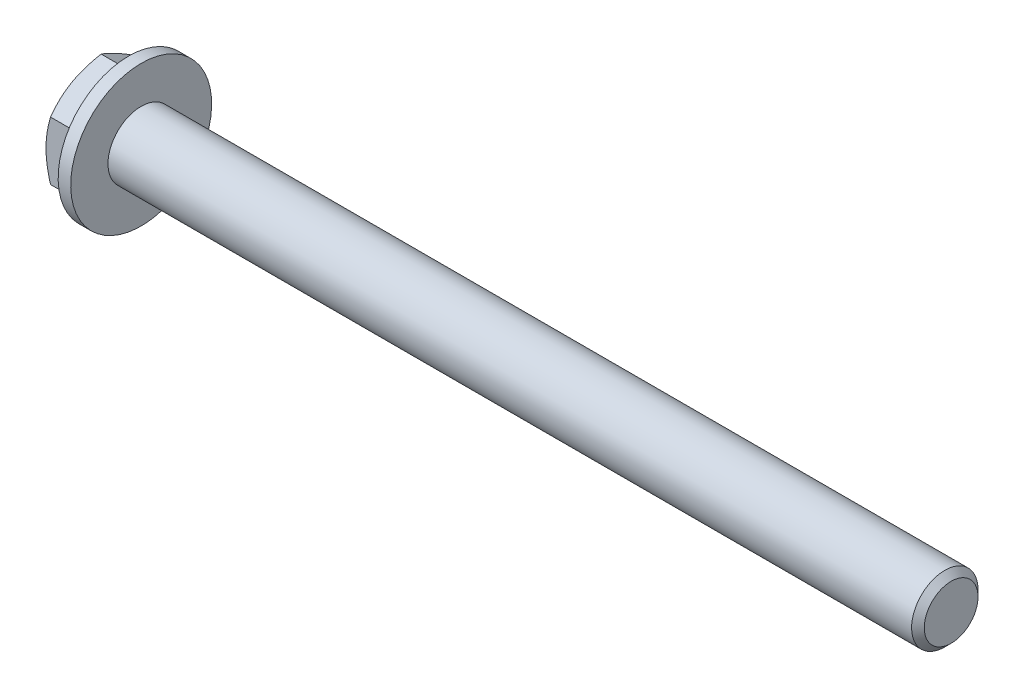
ISO-10303-21;
HEADER;
FILE_DESCRIPTION(('STEP AP214'),'2;1');
FILE_NAME('part.step','',(''),(''),'','','');
FILE_SCHEMA(('AUTOMOTIVE_DESIGN { 1 0 10303 214 1 1 1 1 }'));
ENDSEC;
DATA;
#1=APPLICATION_CONTEXT('core data for automotive mechanical design processes');
#2=APPLICATION_PROTOCOL_DEFINITION('international standard','automotive_design',2000,#1);
#3=PRODUCT_CONTEXT('',#1,'mechanical');
#4=PRODUCT('Part','Part','',(#3));
#5=PRODUCT_RELATED_PRODUCT_CATEGORY('part','',(#4));
#6=PRODUCT_DEFINITION_FORMATION('','',#4);
#7=PRODUCT_DEFINITION_CONTEXT('part definition',#1,'design');
#8=PRODUCT_DEFINITION('design','',#6,#7);
#9=PRODUCT_DEFINITION_SHAPE('','',#8);
#10=(LENGTH_UNIT() NAMED_UNIT(*) SI_UNIT(.MILLI.,.METRE.));
#11=(NAMED_UNIT(*) PLANE_ANGLE_UNIT() SI_UNIT($,.RADIAN.));
#12=(NAMED_UNIT(*) SI_UNIT($,.STERADIAN.) SOLID_ANGLE_UNIT());
#13=UNCERTAINTY_MEASURE_WITH_UNIT(LENGTH_MEASURE(1.E-05),#10,'distance_accuracy_value','');
#14=(GEOMETRIC_REPRESENTATION_CONTEXT(3) GLOBAL_UNCERTAINTY_ASSIGNED_CONTEXT((#13)) GLOBAL_UNIT_ASSIGNED_CONTEXT((#10,
#11,#12)) REPRESENTATION_CONTEXT('',''));
#15=CARTESIAN_POINT('',(0.,0.,0.));
#16=DIRECTION('',(0.,0.,1.));
#17=DIRECTION('',(1.,0.,0.));
#18=AXIS2_PLACEMENT_3D('',#15,#16,#17);
#19=CARTESIAN_POINT('',(0.,3.2512,0.));
#20=DIRECTION('',(1.,0.,0.));
#21=DIRECTION('',(0.,1.,0.));
#22=AXIS2_PLACEMENT_3D('',#19,#20,#21);
#23=PLANE('',#22);
#24=CARTESIAN_POINT('',(0.,0.,0.));
#25=DIRECTION('',(1.,0.,0.));
#26=DIRECTION('',(0.,1.,0.));
#27=AXIS2_PLACEMENT_3D('',#24,#25,#26);
#28=CIRCLE('',#27,2.0828);
#29=CARTESIAN_POINT('',(0.,2.0828,0.));
#30=VERTEX_POINT('',#29);
#31=EDGE_CURVE('E219',#30,#30,#28,.T.);
#32=ORIENTED_EDGE('',*,*,#31,.F.);
#33=EDGE_LOOP('',(#32));
#34=FACE_BOUND('',#33,.T.);
#35=CARTESIAN_POINT('',(0.,0.,0.));
#36=DIRECTION('',(1.,0.,0.));
#37=DIRECTION('',(0.,1.,0.));
#38=AXIS2_PLACEMENT_3D('',#35,#36,#37);
#39=CIRCLE('',#38,4.4196);
#40=CARTESIAN_POINT('',(0.,4.4196,0.));
#41=VERTEX_POINT('',#40);
#42=EDGE_CURVE('E11',#41,#41,#39,.T.);
#43=ORIENTED_EDGE('',*,*,#42,.T.);
#44=EDGE_LOOP('',(#43));
#45=FACE_BOUND('',#44,.T.);
#46=ADVANCED_FACE('F16',(#34,#45),#23,.T.);
#47=CARTESIAN_POINT('',(-0.3937,0.,0.));
#48=DIRECTION('',(1.,0.,0.));
#49=DIRECTION('',(0.,1.,0.));
#50=AXIS2_PLACEMENT_3D('',#47,#48,#49);
#51=CYLINDRICAL_SURFACE('',#50,4.4196);
#52=CARTESIAN_POINT('',(-0.7874,0.,0.));
#53=DIRECTION('',(1.,0.,0.));
#54=DIRECTION('',(0.,1.,0.));
#55=AXIS2_PLACEMENT_3D('',#52,#53,#54);
#56=CIRCLE('',#55,4.4196);
#57=CARTESIAN_POINT('',(-0.7874,4.4196,0.));
#58=VERTEX_POINT('',#57);
#59=EDGE_CURVE('E29',#58,#58,#56,.T.);
#60=ORIENTED_EDGE('',*,*,#59,.T.);
#61=EDGE_LOOP('',(#60));
#62=FACE_BOUND('',#61,.T.);
#63=ORIENTED_EDGE('',*,*,#42,.F.);
#64=EDGE_LOOP('',(#63));
#65=FACE_BOUND('',#64,.T.);
#66=ADVANCED_FACE('F421',(#62,#65),#51,.T.);
#67=CARTESIAN_POINT('',(-0.7874,2.2098,0.));
#68=DIRECTION('',(-1.,0.,0.));
#69=DIRECTION('',(0.,0.,1.));
#70=AXIS2_PLACEMENT_3D('',#67,#68,#69);
#71=PLANE('',#70);
#72=DIRECTION('',(0.,-0.5,0.866025403784439));
#73=VECTOR('',#72,1.);
#74=CARTESIAN_POINT('',(-0.7874,3.66617420935412,0.));
#75=LINE('',#74,#73);
#76=CARTESIAN_POINT('',(-0.7874,3.66617420935412,0.));
#77=VERTEX_POINT('',#76);
#78=CARTESIAN_POINT('',(-0.7874,1.83308710467705,3.175));
#79=VERTEX_POINT('',#78);
#80=EDGE_CURVE('E159',#77,#79,#75,.T.);
#81=ORIENTED_EDGE('',*,*,#80,.T.);
#82=DIRECTION('',(0.,-1.,0.));
#83=VECTOR('',#82,1.);
#84=CARTESIAN_POINT('',(-0.7874,1.83308710467705,3.175));
#85=LINE('',#84,#83);
#86=CARTESIAN_POINT('',(-0.7874,-1.83308710467705,3.175));
#87=VERTEX_POINT('',#86);
#88=EDGE_CURVE('E184',#79,#87,#85,.T.);
#89=ORIENTED_EDGE('',*,*,#88,.T.);
#90=DIRECTION('',(0.,-0.5,-0.866025403784439));
#91=VECTOR('',#90,1.);
#92=CARTESIAN_POINT('',(-0.7874,-1.83308710467705,3.175));
#93=LINE('',#92,#91);
#94=CARTESIAN_POINT('',(-0.7874,-3.66617420935412,0.));
#95=VERTEX_POINT('',#94);
#96=EDGE_CURVE('E195',#87,#95,#93,.T.);
#97=ORIENTED_EDGE('',*,*,#96,.T.);
#98=DIRECTION('',(0.,0.5,-0.866025403784439));
#99=VECTOR('',#98,1.);
#100=CARTESIAN_POINT('',(-0.7874,-3.66617420935412,0.));
#101=LINE('',#100,#99);
#102=CARTESIAN_POINT('',(-0.7874,-1.83308710467705,-3.175));
#103=VERTEX_POINT('',#102);
#104=EDGE_CURVE('E127',#95,#103,#101,.T.);
#105=ORIENTED_EDGE('',*,*,#104,.T.);
#106=DIRECTION('',(0.,1.,0.));
#107=VECTOR('',#106,1.);
#108=CARTESIAN_POINT('',(-0.7874,-1.83308710467705,-3.175));
#109=LINE('',#108,#107);
#110=CARTESIAN_POINT('',(-0.7874,1.83308710467705,-3.175));
#111=VERTEX_POINT('',#110);
#112=EDGE_CURVE('E183',#103,#111,#109,.T.);
#113=ORIENTED_EDGE('',*,*,#112,.T.);
#114=DIRECTION('',(0.,0.5,0.866025403784438));
#115=VECTOR('',#114,1.);
#116=CARTESIAN_POINT('',(-0.7874,1.83308710467705,-3.175));
#117=LINE('',#116,#115);
#118=EDGE_CURVE('E182',#111,#77,#117,.T.);
#119=ORIENTED_EDGE('',*,*,#118,.T.);
#120=EDGE_LOOP('',(#81,#89,#97,#105,#113,#119));
#121=FACE_BOUND('',#120,.T.);
#122=ORIENTED_EDGE('',*,*,#59,.F.);
#123=EDGE_LOOP('',(#122));
#124=FACE_BOUND('',#123,.T.);
#125=ADVANCED_FACE('F416',(#121,#124),#71,.T.);
#126=CARTESIAN_POINT('',(-2.794,0.,0.));
#127=DIRECTION('',(1.,0.,0.));
#128=DIRECTION('',(0.,1.,0.));
#129=AXIS2_PLACEMENT_3D('',#126,#127,#128);
#130=PLANE('',#129);
#131=CARTESIAN_POINT('',(-2.794,0.,0.));
#132=DIRECTION('',(-1.,0.,0.));
#133=DIRECTION('',(0.,1.,0.));
#134=AXIS2_PLACEMENT_3D('',#131,#132,#133);
#135=CIRCLE('',#134,3.175);
#136=CARTESIAN_POINT('',(-2.794,2.7496306570156,1.5875));
#137=VERTEX_POINT('',#136);
#138=CARTESIAN_POINT('',(-2.794,2.7496306570156,-1.5875));
#139=VERTEX_POINT('',#138);
#140=EDGE_CURVE('E266',#137,#139,#135,.T.);
#141=ORIENTED_EDGE('',*,*,#140,.T.);
#142=CARTESIAN_POINT('',(-2.794,0.,0.));
#143=DIRECTION('',(-1.,0.,0.));
#144=DIRECTION('',(0.,1.,0.));
#145=AXIS2_PLACEMENT_3D('',#142,#143,#144);
#146=CIRCLE('',#145,3.175);
#147=CARTESIAN_POINT('',(-2.794,0.,-3.175));
#148=VERTEX_POINT('',#147);
#149=EDGE_CURVE('E214',#139,#148,#146,.T.);
#150=ORIENTED_EDGE('',*,*,#149,.T.);
#151=CARTESIAN_POINT('',(-2.794,0.,0.));
#152=DIRECTION('',(-1.,0.,0.));
#153=DIRECTION('',(0.,1.,0.));
#154=AXIS2_PLACEMENT_3D('',#151,#152,#153);
#155=CIRCLE('',#154,3.175);
#156=CARTESIAN_POINT('',(-2.794,-2.7496306570156,-1.5875));
#157=VERTEX_POINT('',#156);
#158=EDGE_CURVE('E151',#148,#157,#155,.T.);
#159=ORIENTED_EDGE('',*,*,#158,.T.);
#160=CARTESIAN_POINT('',(-2.794,0.,0.));
#161=DIRECTION('',(-1.,0.,0.));
#162=DIRECTION('',(0.,1.,0.));
#163=AXIS2_PLACEMENT_3D('',#160,#161,#162);
#164=CIRCLE('',#163,3.175);
#165=CARTESIAN_POINT('',(-2.794,-2.7496306570156,1.5875));
#166=VERTEX_POINT('',#165);
#167=EDGE_CURVE('E141',#157,#166,#164,.T.);
#168=ORIENTED_EDGE('',*,*,#167,.T.);
#169=CARTESIAN_POINT('',(-2.794,0.,0.));
#170=DIRECTION('',(-1.,0.,0.));
#171=DIRECTION('',(0.,1.,0.));
#172=AXIS2_PLACEMENT_3D('',#169,#170,#171);
#173=CIRCLE('',#172,3.175);
#174=CARTESIAN_POINT('',(-2.794,0.,3.175));
#175=VERTEX_POINT('',#174);
#176=EDGE_CURVE('E169',#166,#175,#173,.T.);
#177=ORIENTED_EDGE('',*,*,#176,.T.);
#178=CARTESIAN_POINT('',(-2.794,0.,0.));
#179=DIRECTION('',(-1.,0.,0.));
#180=DIRECTION('',(0.,1.,0.));
#181=AXIS2_PLACEMENT_3D('',#178,#179,#180);
#182=CIRCLE('',#181,3.175);
#183=EDGE_CURVE('E199',#175,#137,#182,.T.);
#184=ORIENTED_EDGE('',*,*,#183,.T.);
#185=EDGE_LOOP('',(#141,#150,#159,#168,#177,#184));
#186=FACE_BOUND('',#185,.T.);
#187=ADVANCED_FACE('F410',(#186),#130,.F.);
#188=CARTESIAN_POINT('',(0.,3.66617420935412,0.));
#189=DIRECTION('',(0.,0.866025403784439,0.5));
#190=DIRECTION('',(1.,0.,0.));
#191=AXIS2_PLACEMENT_3D('',#188,#189,#190);
#192=PLANE('',#191);
#193=CARTESIAN_POINT('',(-2.794,2.7496306570156,1.5875));
#194=CARTESIAN_POINT('',(-2.794,2.3242613140312,2.32426131403117));
#195=CARTESIAN_POINT('',(-2.5104204380104,1.83308710467705,3.175));
#196=(BOUNDED_CURVE() B_SPLINE_CURVE(2,(#193,#194,#195),.UNSPECIFIED.,.F.,
.F.) B_SPLINE_CURVE_WITH_KNOTS((3,3),(0.185962835711139,0.371925671422279),
.UNSPECIFIED.) CURVE() GEOMETRIC_REPRESENTATION_ITEM() RATIONAL_B_SPLINE_CURVE((1.,
1.03795484930205,1.)) REPRESENTATION_ITEM(''));
#197=CARTESIAN_POINT('',(-2.5104204380104,1.83308710467705,3.175));
#198=VERTEX_POINT('',#197);
#199=EDGE_CURVE('E202',#137,#198,#196,.T.);
#200=ORIENTED_EDGE('',*,*,#199,.T.);
#201=DIRECTION('',(-1.,0.,0.));
#202=VECTOR('',#201,1.);
#203=CARTESIAN_POINT('',(-0.7874,1.83308710467705,3.175));
#204=LINE('',#203,#202);
#205=EDGE_CURVE('E157',#79,#198,#204,.T.);
#206=ORIENTED_EDGE('',*,*,#205,.F.);
#207=ORIENTED_EDGE('',*,*,#80,.F.);
#208=DIRECTION('',(-1.,0.,0.));
#209=VECTOR('',#208,1.);
#210=CARTESIAN_POINT('',(-0.7874,3.66617420935412,0.));
#211=LINE('',#210,#209);
#212=CARTESIAN_POINT('',(-2.5104204380104,3.66617420935412,0.));
#213=VERTEX_POINT('',#212);
#214=EDGE_CURVE('E176',#77,#213,#211,.T.);
#215=ORIENTED_EDGE('',*,*,#214,.T.);
#216=CARTESIAN_POINT('',(-2.5104204380104,3.66617420935412,0.));
#217=CARTESIAN_POINT('',(-2.794,3.175,0.850738685968807));
#218=CARTESIAN_POINT('',(-2.794,2.7496306570156,1.5875));
#219=(BOUNDED_CURVE() B_SPLINE_CURVE(2,(#216,#217,#218),.UNSPECIFIED.,.F.,
.F.) B_SPLINE_CURVE_WITH_KNOTS((3,3),(0.,0.185962835711139),
.UNSPECIFIED.) CURVE() GEOMETRIC_REPRESENTATION_ITEM() RATIONAL_B_SPLINE_CURVE((1.,
1.03795484930205,1.)) REPRESENTATION_ITEM(''));
#220=EDGE_CURVE('E270',#213,#137,#219,.T.);
#221=ORIENTED_EDGE('',*,*,#220,.T.);
#222=EDGE_LOOP('',(#200,#206,#207,#215,#221));
#223=FACE_BOUND('',#222,.T.);
#224=ADVANCED_FACE('F404',(#223),#192,.T.);
#225=CARTESIAN_POINT('',(0.,1.83308710467705,3.175));
#226=DIRECTION('',(0.,0.,1.));
#227=DIRECTION('',(1.,0.,0.));
#228=AXIS2_PLACEMENT_3D('',#225,#226,#227);
#229=PLANE('',#228);
#230=CARTESIAN_POINT('',(-2.794,0.,3.175));
#231=CARTESIAN_POINT('',(-2.794,-0.850738685968806,3.175));
#232=CARTESIAN_POINT('',(-2.5104204380104,-1.83308710467705,3.175));
#233=(BOUNDED_CURVE() B_SPLINE_CURVE(2,(#230,#231,#232),.UNSPECIFIED.,.F.,
.F.) B_SPLINE_CURVE_WITH_KNOTS((3,3),(0.185962835711139,0.371925671422277),
.UNSPECIFIED.) CURVE() GEOMETRIC_REPRESENTATION_ITEM() RATIONAL_B_SPLINE_CURVE((1.,
1.03795484930205,1.)) REPRESENTATION_ITEM(''));
#234=CARTESIAN_POINT('',(-2.5104204380104,-1.83308710467705,3.175));
#235=VERTEX_POINT('',#234);
#236=EDGE_CURVE('E192',#175,#235,#233,.T.);
#237=ORIENTED_EDGE('',*,*,#236,.T.);
#238=DIRECTION('',(-1.,0.,0.));
#239=VECTOR('',#238,1.);
#240=CARTESIAN_POINT('',(-0.7874,-1.83308710467705,3.175));
#241=LINE('',#240,#239);
#242=EDGE_CURVE('E188',#87,#235,#241,.T.);
#243=ORIENTED_EDGE('',*,*,#242,.F.);
#244=ORIENTED_EDGE('',*,*,#88,.F.);
#245=ORIENTED_EDGE('',*,*,#205,.T.);
#246=CARTESIAN_POINT('',(-2.5104204380104,1.83308710467705,3.175));
#247=CARTESIAN_POINT('',(-2.794,0.850738685968806,3.175));
#248=CARTESIAN_POINT('',(-2.794,0.,3.175));
#249=(BOUNDED_CURVE() B_SPLINE_CURVE(2,(#246,#247,#248),.UNSPECIFIED.,.F.,
.F.) B_SPLINE_CURVE_WITH_KNOTS((3,3),(0.,0.185962835711139),
.UNSPECIFIED.) CURVE() GEOMETRIC_REPRESENTATION_ITEM() RATIONAL_B_SPLINE_CURVE((1.,
1.03795484930203,1.)) REPRESENTATION_ITEM(''));
#250=EDGE_CURVE('E285',#198,#175,#249,.T.);
#251=ORIENTED_EDGE('',*,*,#250,.T.);
#252=EDGE_LOOP('',(#237,#243,#244,#245,#251));
#253=FACE_BOUND('',#252,.T.);
#254=ADVANCED_FACE('F409',(#253),#229,.T.);
#255=CARTESIAN_POINT('',(0.,-1.83308710467705,3.175));
#256=DIRECTION('',(0.,-0.866025403784439,0.5));
#257=DIRECTION('',(-1.,0.,0.));
#258=AXIS2_PLACEMENT_3D('',#255,#256,#257);
#259=PLANE('',#258);
#260=CARTESIAN_POINT('',(-2.794,-2.7496306570156,1.5875));
#261=CARTESIAN_POINT('',(-2.794,-3.175,0.850738685968832));
#262=CARTESIAN_POINT('',(-2.5104204380104,-3.66617420935412,0.));
#263=(BOUNDED_CURVE() B_SPLINE_CURVE(2,(#260,#261,#262),.UNSPECIFIED.,.F.,
.F.) B_SPLINE_CURVE_WITH_KNOTS((3,3),(0.185962835711138,0.371925671422277),
.UNSPECIFIED.) CURVE() GEOMETRIC_REPRESENTATION_ITEM() RATIONAL_B_SPLINE_CURVE((1.,
1.03795484930205,1.)) REPRESENTATION_ITEM(''));
#264=CARTESIAN_POINT('',(-2.5104204380104,-3.66617420935412,0.));
#265=VERTEX_POINT('',#264);
#266=EDGE_CURVE('E135',#166,#265,#263,.T.);
#267=ORIENTED_EDGE('',*,*,#266,.T.);
#268=DIRECTION('',(-1.,0.,0.));
#269=VECTOR('',#268,1.);
#270=CARTESIAN_POINT('',(-0.7874,-3.66617420935412,0.));
#271=LINE('',#270,#269);
#272=EDGE_CURVE('E118',#95,#265,#271,.T.);
#273=ORIENTED_EDGE('',*,*,#272,.F.);
#274=ORIENTED_EDGE('',*,*,#96,.F.);
#275=ORIENTED_EDGE('',*,*,#242,.T.);
#276=CARTESIAN_POINT('',(-2.5104204380104,-1.83308710467705,3.175));
#277=CARTESIAN_POINT('',(-2.794,-2.32426131403119,2.32426131403117));
#278=CARTESIAN_POINT('',(-2.794,-2.7496306570156,1.5875));
#279=(BOUNDED_CURVE() B_SPLINE_CURVE(2,(#276,#277,#278),.UNSPECIFIED.,.F.,
.F.) B_SPLINE_CURVE_WITH_KNOTS((3,3),(0.,0.185962835711138),
.UNSPECIFIED.) CURVE() GEOMETRIC_REPRESENTATION_ITEM() RATIONAL_B_SPLINE_CURVE((1.,
1.03795484930204,1.)) REPRESENTATION_ITEM(''));
#280=EDGE_CURVE('E137',#235,#166,#279,.T.);
#281=ORIENTED_EDGE('',*,*,#280,.T.);
#282=EDGE_LOOP('',(#267,#273,#274,#275,#281));
#283=FACE_BOUND('',#282,.T.);
#284=ADVANCED_FACE('F18',(#283),#259,.T.);
#285=CARTESIAN_POINT('',(0.,1.83308710467705,-3.175));
#286=DIRECTION('',(0.,0.866025403784438,-0.5));
#287=DIRECTION('',(-1.,0.,0.));
#288=AXIS2_PLACEMENT_3D('',#285,#286,#287);
#289=PLANE('',#288);
#290=CARTESIAN_POINT('',(-2.5104204380104,1.83308710467705,-3.175));
#291=CARTESIAN_POINT('',(-2.794,2.3242613140312,-2.3242613140312));
#292=CARTESIAN_POINT('',(-2.794,2.7496306570156,-1.5875));
#293=(BOUNDED_CURVE() B_SPLINE_CURVE(2,(#290,#291,#292),.UNSPECIFIED.,.F.,
.F.) B_SPLINE_CURVE_WITH_KNOTS((3,3),(0.,0.185962835711139),
.UNSPECIFIED.) CURVE() GEOMETRIC_REPRESENTATION_ITEM() RATIONAL_B_SPLINE_CURVE((1.,
1.03795484930205,1.)) REPRESENTATION_ITEM(''));
#294=CARTESIAN_POINT('',(-2.5104204380104,1.83308710467705,-3.175));
#295=VERTEX_POINT('',#294);
#296=EDGE_CURVE('E207',#295,#139,#293,.T.);
#297=ORIENTED_EDGE('',*,*,#296,.T.);
#298=CARTESIAN_POINT('',(-2.794,2.7496306570156,-1.5875));
#299=CARTESIAN_POINT('',(-2.794,3.175,-0.850738685968807));
#300=CARTESIAN_POINT('',(-2.5104204380104,3.66617420935412,0.));
#301=(BOUNDED_CURVE() B_SPLINE_CURVE(2,(#298,#299,#300),.UNSPECIFIED.,.F.,
.F.) B_SPLINE_CURVE_WITH_KNOTS((3,3),(0.185962835711139,0.371925671422278),
.UNSPECIFIED.) CURVE() GEOMETRIC_REPRESENTATION_ITEM() RATIONAL_B_SPLINE_CURVE((1.,
1.03795484930205,1.)) REPRESENTATION_ITEM(''));
#302=EDGE_CURVE('E227',#139,#213,#301,.T.);
#303=ORIENTED_EDGE('',*,*,#302,.T.);
#304=ORIENTED_EDGE('',*,*,#214,.F.);
#305=ORIENTED_EDGE('',*,*,#118,.F.);
#306=DIRECTION('',(-1.,0.,0.));
#307=VECTOR('',#306,1.);
#308=CARTESIAN_POINT('',(-0.7874,1.83308710467705,-3.175));
#309=LINE('',#308,#307);
#310=EDGE_CURVE('E131',#111,#295,#309,.T.);
#311=ORIENTED_EDGE('',*,*,#310,.T.);
#312=EDGE_LOOP('',(#297,#303,#304,#305,#311));
#313=FACE_BOUND('',#312,.T.);
#314=ADVANCED_FACE('F313',(#313),#289,.T.);
#315=CARTESIAN_POINT('',(0.,-1.83308710467705,-3.175));
#316=DIRECTION('',(0.,0.,-1.));
#317=DIRECTION('',(0.,-1.,0.));
#318=AXIS2_PLACEMENT_3D('',#315,#316,#317);
#319=PLANE('',#318);
#320=CARTESIAN_POINT('',(-2.5104204380104,-1.83308710467705,-3.175));
#321=CARTESIAN_POINT('',(-2.794,-0.850738685968807,-3.175));
#322=CARTESIAN_POINT('',(-2.794,0.,-3.175));
#323=(BOUNDED_CURVE() B_SPLINE_CURVE(2,(#320,#321,#322),.UNSPECIFIED.,.F.,
.F.) B_SPLINE_CURVE_WITH_KNOTS((3,3),(0.,0.185962835711139),
.UNSPECIFIED.) CURVE() GEOMETRIC_REPRESENTATION_ITEM() RATIONAL_B_SPLINE_CURVE((1.,
1.03795484930205,1.)) REPRESENTATION_ITEM(''));
#324=CARTESIAN_POINT('',(-2.5104204380104,-1.83308710467708,-3.175));
#325=VERTEX_POINT('',#324);
#326=EDGE_CURVE('E145',#325,#148,#323,.T.);
#327=ORIENTED_EDGE('',*,*,#326,.T.);
#328=CARTESIAN_POINT('',(-2.794,0.,-3.175));
#329=CARTESIAN_POINT('',(-2.794,0.850738685968806,-3.175));
#330=CARTESIAN_POINT('',(-2.5104204380104,1.83308710467705,-3.175));
#331=(BOUNDED_CURVE() B_SPLINE_CURVE(2,(#328,#329,#330),.UNSPECIFIED.,.F.,
.F.) B_SPLINE_CURVE_WITH_KNOTS((3,3),(0.185962835711139,0.371925671422278),
.UNSPECIFIED.) CURVE() GEOMETRIC_REPRESENTATION_ITEM() RATIONAL_B_SPLINE_CURVE((1.,
1.03795484930202,1.)) REPRESENTATION_ITEM(''));
#332=EDGE_CURVE('E20',#148,#295,#331,.T.);
#333=ORIENTED_EDGE('',*,*,#332,.T.);
#334=ORIENTED_EDGE('',*,*,#310,.F.);
#335=ORIENTED_EDGE('',*,*,#112,.F.);
#336=DIRECTION('',(-1.,0.,0.));
#337=VECTOR('',#336,1.);
#338=CARTESIAN_POINT('',(-0.7874,-1.83308710467705,-3.175));
#339=LINE('',#338,#337);
#340=EDGE_CURVE('E198',#103,#325,#339,.T.);
#341=ORIENTED_EDGE('',*,*,#340,.T.);
#342=EDGE_LOOP('',(#327,#333,#334,#335,#341));
#343=FACE_BOUND('',#342,.T.);
#344=ADVANCED_FACE('F468',(#343),#319,.T.);
#345=CARTESIAN_POINT('',(0.,-3.66617420935412,0.));
#346=DIRECTION('',(0.,-0.866025403784439,-0.5));
#347=DIRECTION('',(0.,0.5,-0.866025403784439));
#348=AXIS2_PLACEMENT_3D('',#345,#346,#347);
#349=PLANE('',#348);
#350=CARTESIAN_POINT('',(-2.5104204380104,-3.66617420935412,0.));
#351=CARTESIAN_POINT('',(-2.794,-3.175,-0.850738685968806));
#352=CARTESIAN_POINT('',(-2.794,-2.7496306570156,-1.5875));
#353=(BOUNDED_CURVE() B_SPLINE_CURVE(2,(#350,#351,#352),.UNSPECIFIED.,.F.,
.F.) B_SPLINE_CURVE_WITH_KNOTS((3,3),(0.,0.185962835711138),
.UNSPECIFIED.) CURVE() GEOMETRIC_REPRESENTATION_ITEM() RATIONAL_B_SPLINE_CURVE((1.,
1.03795484930203,1.)) REPRESENTATION_ITEM(''));
#354=EDGE_CURVE('E123',#265,#157,#353,.T.);
#355=ORIENTED_EDGE('',*,*,#354,.T.);
#356=CARTESIAN_POINT('',(-2.794,-2.7496306570156,-1.5875));
#357=CARTESIAN_POINT('',(-2.794,-2.3242613140312,-2.32426131403117));
#358=CARTESIAN_POINT('',(-2.5104204380104,-1.83308710467708,-3.175));
#359=(BOUNDED_CURVE() B_SPLINE_CURVE(2,(#356,#357,#358),.UNSPECIFIED.,.F.,
.F.) B_SPLINE_CURVE_WITH_KNOTS((3,3),(0.185962835711138,0.371925671422277),
.UNSPECIFIED.) CURVE() GEOMETRIC_REPRESENTATION_ITEM() RATIONAL_B_SPLINE_CURVE((1.,
1.03795484930201,1.)) REPRESENTATION_ITEM(''));
#360=EDGE_CURVE('E165',#157,#325,#359,.T.);
#361=ORIENTED_EDGE('',*,*,#360,.T.);
#362=ORIENTED_EDGE('',*,*,#340,.F.);
#363=ORIENTED_EDGE('',*,*,#104,.F.);
#364=ORIENTED_EDGE('',*,*,#272,.T.);
#365=EDGE_LOOP('',(#355,#361,#362,#363,#364));
#366=FACE_BOUND('',#365,.T.);
#367=ADVANCED_FACE('F120',(#366),#349,.T.);
#368=CARTESIAN_POINT('',(-2.6522102190052,0.,0.));
#369=DIRECTION('',(1.,0.,0.));
#370=DIRECTION('',(0.,1.,0.));
#371=AXIS2_PLACEMENT_3D('',#368,#369,#370);
#372=CONICAL_SURFACE('',#371,3.42058710467706,1.04719755);
#373=ORIENTED_EDGE('',*,*,#354,.F.);
#374=ORIENTED_EDGE('',*,*,#266,.F.);
#375=ORIENTED_EDGE('',*,*,#167,.F.);
#376=EDGE_LOOP('',(#373,#374,#375));
#377=FACE_BOUND('',#376,.T.);
#378=ADVANCED_FACE('F143',(#377),#372,.T.);
#379=CARTESIAN_POINT('',(-2.6522102190052,0.,0.));
#380=DIRECTION('',(1.,0.,0.));
#381=DIRECTION('',(0.,1.,0.));
#382=AXIS2_PLACEMENT_3D('',#379,#380,#381);
#383=CONICAL_SURFACE('',#382,3.42058710467706,1.04719755);
#384=ORIENTED_EDGE('',*,*,#360,.F.);
#385=ORIENTED_EDGE('',*,*,#158,.F.);
#386=ORIENTED_EDGE('',*,*,#326,.F.);
#387=EDGE_LOOP('',(#384,#385,#386));
#388=FACE_BOUND('',#387,.T.);
#389=ADVANCED_FACE('F457',(#388),#383,.T.);
#390=CARTESIAN_POINT('',(-2.6522102190052,0.,0.));
#391=DIRECTION('',(1.,0.,0.));
#392=DIRECTION('',(0.,1.,0.));
#393=AXIS2_PLACEMENT_3D('',#390,#391,#392);
#394=CONICAL_SURFACE('',#393,3.42058710467706,1.04719755);
#395=ORIENTED_EDGE('',*,*,#280,.F.);
#396=ORIENTED_EDGE('',*,*,#236,.F.);
#397=ORIENTED_EDGE('',*,*,#176,.F.);
#398=EDGE_LOOP('',(#395,#396,#397));
#399=FACE_BOUND('',#398,.T.);
#400=ADVANCED_FACE('F451',(#399),#394,.T.);
#401=CARTESIAN_POINT('',(-2.6522102190052,0.,0.));
#402=DIRECTION('',(1.,0.,0.));
#403=DIRECTION('',(0.,1.,0.));
#404=AXIS2_PLACEMENT_3D('',#401,#402,#403);
#405=CONICAL_SURFACE('',#404,3.42058710467706,1.04719755);
#406=ORIENTED_EDGE('',*,*,#332,.F.);
#407=ORIENTED_EDGE('',*,*,#149,.F.);
#408=ORIENTED_EDGE('',*,*,#296,.F.);
#409=EDGE_LOOP('',(#406,#407,#408));
#410=FACE_BOUND('',#409,.T.);
#411=ADVANCED_FACE('F456',(#410),#405,.T.);
#412=CARTESIAN_POINT('',(-2.6522102190052,0.,0.));
#413=DIRECTION('',(1.,0.,0.));
#414=DIRECTION('',(0.,1.,0.));
#415=AXIS2_PLACEMENT_3D('',#412,#413,#414);
#416=CONICAL_SURFACE('',#415,3.42058710467706,1.04719755);
#417=ORIENTED_EDGE('',*,*,#250,.F.);
#418=ORIENTED_EDGE('',*,*,#199,.F.);
#419=ORIENTED_EDGE('',*,*,#183,.F.);
#420=EDGE_LOOP('',(#417,#418,#419));
#421=FACE_BOUND('',#420,.T.);
#422=ADVANCED_FACE('F518',(#421),#416,.T.);
#423=CARTESIAN_POINT('',(-2.6522102190052,0.,0.));
#424=DIRECTION('',(1.,0.,0.));
#425=DIRECTION('',(0.,1.,0.));
#426=AXIS2_PLACEMENT_3D('',#423,#424,#425);
#427=CONICAL_SURFACE('',#426,3.42058710467706,1.04719755);
#428=ORIENTED_EDGE('',*,*,#302,.F.);
#429=ORIENTED_EDGE('',*,*,#140,.F.);
#430=ORIENTED_EDGE('',*,*,#220,.F.);
#431=EDGE_LOOP('',(#428,#429,#430));
#432=FACE_BOUND('',#431,.T.);
#433=ADVANCED_FACE('F320',(#432),#427,.T.);
#434=CARTESIAN_POINT('',(50.8,1.0414,0.));
#435=DIRECTION('',(1.,0.,0.));
#436=DIRECTION('',(0.,1.,0.));
#437=AXIS2_PLACEMENT_3D('',#434,#435,#436);
#438=PLANE('',#437);
#439=CARTESIAN_POINT('',(50.8,0.,0.));
#440=DIRECTION('',(-1.,0.,0.));
#441=DIRECTION('',(0.,-1.,0.));
#442=AXIS2_PLACEMENT_3D('',#439,#440,#441);
#443=CIRCLE('',#442,1.68529);
#444=CARTESIAN_POINT('',(50.8,1.68529,0.));
#445=VERTEX_POINT('',#444);
#446=EDGE_CURVE('E217',#445,#445,#443,.T.);
#447=ORIENTED_EDGE('',*,*,#446,.F.);
#448=EDGE_LOOP('',(#447));
#449=FACE_BOUND('',#448,.T.);
#450=ADVANCED_FACE('F441',(#449),#438,.T.);
#451=CARTESIAN_POINT('',(29.21,0.,0.));
#452=DIRECTION('',(1.,0.,0.));
#453=DIRECTION('',(0.,1.,0.));
#454=AXIS2_PLACEMENT_3D('',#451,#452,#453);
#455=CYLINDRICAL_SURFACE('',#454,2.0828);
#456=CARTESIAN_POINT('',(50.40249,0.,0.));
#457=DIRECTION('',(1.,0.,0.));
#458=DIRECTION('',(0.,-1.,0.));
#459=AXIS2_PLACEMENT_3D('',#456,#457,#458);
#460=CIRCLE('',#459,2.0828);
#461=CARTESIAN_POINT('',(50.40249,2.0828,0.));
#462=VERTEX_POINT('',#461);
#463=EDGE_CURVE('E220',#462,#462,#460,.T.);
#464=ORIENTED_EDGE('',*,*,#463,.F.);
#465=EDGE_LOOP('',(#464));
#466=FACE_BOUND('',#465,.T.);
#467=ORIENTED_EDGE('',*,*,#31,.T.);
#468=EDGE_LOOP('',(#467));
#469=FACE_BOUND('',#468,.T.);
#470=ADVANCED_FACE('F399',(#466,#469),#455,.T.);
#471=CARTESIAN_POINT('',(50.601245,0.,0.));
#472=DIRECTION('',(-1.,0.,0.));
#473=DIRECTION('',(0.,-1.,0.));
#474=AXIS2_PLACEMENT_3D('',#471,#472,#473);
#475=CONICAL_SURFACE('',#474,1.884045,0.785398162499999);
#476=ORIENTED_EDGE('',*,*,#446,.T.);
#477=EDGE_LOOP('',(#476));
#478=FACE_BOUND('',#477,.T.);
#479=ORIENTED_EDGE('',*,*,#463,.T.);
#480=EDGE_LOOP('',(#479));
#481=FACE_BOUND('',#480,.T.);
#482=ADVANCED_FACE('F395',(#478,#481),#475,.T.);
#483=CLOSED_SHELL('',(#46,#66,#125,#187,#224,#254,#284,#314,#344,#367,#378,#389,#400,#411,#422,
#433,#450,#470,#482));
#484=MANIFOLD_SOLID_BREP('B1',#483);
#485=ADVANCED_BREP_SHAPE_REPRESENTATION('',(#18,#484),#14);
#486=SHAPE_DEFINITION_REPRESENTATION(#9,#485);
ENDSEC;
END-ISO-10303-21;
